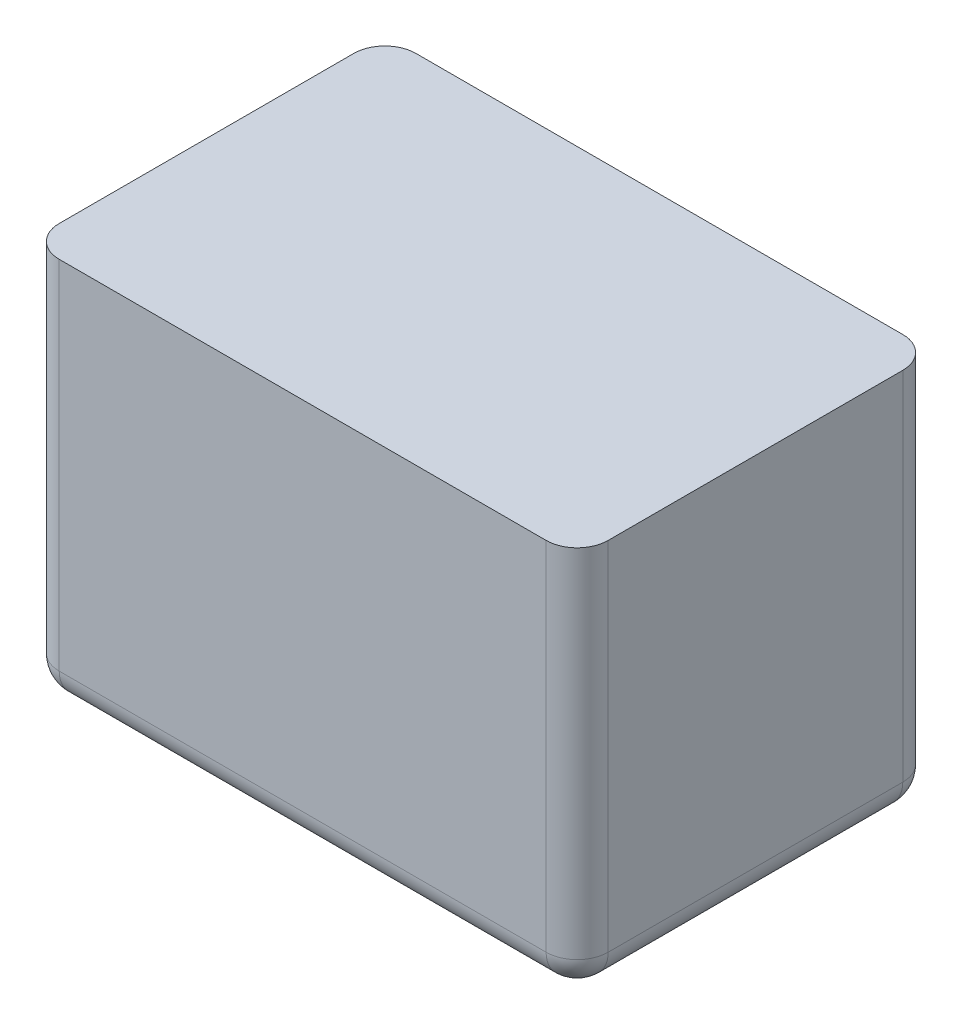
ISO-10303-21;
HEADER;
FILE_DESCRIPTION(('STEP AP214'),'2;1');
FILE_NAME('part.step','',(''),(''),'','','');
FILE_SCHEMA(('AUTOMOTIVE_DESIGN { 1 0 10303 214 1 1 1 1 }'));
ENDSEC;
DATA;
#1=APPLICATION_CONTEXT('core data for automotive mechanical design processes');
#2=APPLICATION_PROTOCOL_DEFINITION('international standard','automotive_design',2000,#1);
#3=PRODUCT_CONTEXT('',#1,'mechanical');
#4=PRODUCT('Part','Part','',(#3));
#5=PRODUCT_RELATED_PRODUCT_CATEGORY('part','',(#4));
#6=PRODUCT_DEFINITION_FORMATION('','',#4);
#7=PRODUCT_DEFINITION_CONTEXT('part definition',#1,'design');
#8=PRODUCT_DEFINITION('design','',#6,#7);
#9=PRODUCT_DEFINITION_SHAPE('','',#8);
#10=(LENGTH_UNIT() NAMED_UNIT(*) SI_UNIT(.MILLI.,.METRE.));
#11=(NAMED_UNIT(*) PLANE_ANGLE_UNIT() SI_UNIT($,.RADIAN.));
#12=(NAMED_UNIT(*) SI_UNIT($,.STERADIAN.) SOLID_ANGLE_UNIT());
#13=UNCERTAINTY_MEASURE_WITH_UNIT(LENGTH_MEASURE(1.E-05),#10,'distance_accuracy_value','');
#14=(GEOMETRIC_REPRESENTATION_CONTEXT(3) GLOBAL_UNCERTAINTY_ASSIGNED_CONTEXT((#13)) GLOBAL_UNIT_ASSIGNED_CONTEXT((#10,
#11,#12)) REPRESENTATION_CONTEXT('',''));
#15=CARTESIAN_POINT('',(0.,0.,0.));
#16=DIRECTION('',(0.,0.,1.));
#17=DIRECTION('',(1.,0.,0.));
#18=AXIS2_PLACEMENT_3D('',#15,#16,#17);
#19=CARTESIAN_POINT('',(8.85,0.,5.75));
#20=DIRECTION('',(1.,0.,0.));
#21=DIRECTION('',(0.,1.,0.));
#22=AXIS2_PLACEMENT_3D('',#19,#20,#21);
#23=PLANE('',#22);
#24=DIRECTION('',(0.,-1.,0.));
#25=VECTOR('',#24,1.);
#26=CARTESIAN_POINT('',(8.85,0.,-4.75));
#27=LINE('',#26,#25);
#28=CARTESIAN_POINT('',(8.85,12.5,-4.75));
#29=VERTEX_POINT('',#28);
#30=CARTESIAN_POINT('',(8.85,1.,-4.75));
#31=VERTEX_POINT('',#30);
#32=EDGE_CURVE('E247',#29,#31,#27,.T.);
#33=ORIENTED_EDGE('',*,*,#32,.F.);
#34=DIRECTION('',(0.,0.,-1.));
#35=VECTOR('',#34,1.);
#36=CARTESIAN_POINT('',(8.85,12.5,5.75));
#37=LINE('',#36,#35);
#38=CARTESIAN_POINT('',(8.85,12.5,4.75));
#39=VERTEX_POINT('',#38);
#40=EDGE_CURVE('E176',#39,#29,#37,.T.);
#41=ORIENTED_EDGE('',*,*,#40,.F.);
#42=DIRECTION('',(0.,1.,0.));
#43=VECTOR('',#42,1.);
#44=CARTESIAN_POINT('',(8.85,0.,4.75));
#45=LINE('',#44,#43);
#46=CARTESIAN_POINT('',(8.85,1.,4.75));
#47=VERTEX_POINT('',#46);
#48=EDGE_CURVE('E10',#47,#39,#45,.T.);
#49=ORIENTED_EDGE('',*,*,#48,.F.);
#50=DIRECTION('',(0.,0.,1.));
#51=VECTOR('',#50,1.);
#52=CARTESIAN_POINT('',(8.85,1.,2.875));
#53=LINE('',#52,#51);
#54=EDGE_CURVE('E19',#31,#47,#53,.T.);
#55=ORIENTED_EDGE('',*,*,#54,.F.);
#56=EDGE_LOOP('',(#33,#41,#49,#55));
#57=FACE_BOUND('',#56,.T.);
#58=ADVANCED_FACE('F16',(#57),#23,.T.);
#59=CARTESIAN_POINT('',(7.85,0.,4.75));
#60=DIRECTION('',(0.,1.,0.));
#61=DIRECTION('',(0.707106781186547,0.,0.707106781186548));
#62=AXIS2_PLACEMENT_3D('',#59,#60,#61);
#63=CYLINDRICAL_SURFACE('',#62,1.);
#64=CARTESIAN_POINT('',(7.85,12.5,4.75));
#65=DIRECTION('',(0.,-1.,0.));
#66=DIRECTION('',(0.707106781186547,0.,0.707106781186548));
#67=AXIS2_PLACEMENT_3D('',#64,#65,#66);
#68=CIRCLE('',#67,1.);
#69=CARTESIAN_POINT('',(7.85,12.5,5.75));
#70=VERTEX_POINT('',#69);
#71=EDGE_CURVE('E180',#39,#70,#68,.T.);
#72=ORIENTED_EDGE('',*,*,#71,.T.);
#73=DIRECTION('',(0.,-1.,0.));
#74=VECTOR('',#73,1.);
#75=CARTESIAN_POINT('',(7.85,0.,5.75));
#76=LINE('',#75,#74);
#77=CARTESIAN_POINT('',(7.85,1.,5.75));
#78=VERTEX_POINT('',#77);
#79=EDGE_CURVE('E312',#70,#78,#76,.T.);
#80=ORIENTED_EDGE('',*,*,#79,.T.);
#81=CARTESIAN_POINT('',(7.85,1.,4.75));
#82=DIRECTION('',(0.,1.,0.));
#83=DIRECTION('',(0.,0.,1.));
#84=AXIS2_PLACEMENT_3D('',#81,#82,#83);
#85=CIRCLE('',#84,1.);
#86=EDGE_CURVE('E45',#78,#47,#85,.T.);
#87=ORIENTED_EDGE('',*,*,#86,.T.);
#88=ORIENTED_EDGE('',*,*,#48,.T.);
#89=EDGE_LOOP('',(#72,#80,#87,#88));
#90=FACE_BOUND('',#89,.T.);
#91=ADVANCED_FACE('F334',(#90),#63,.T.);
#92=CARTESIAN_POINT('',(7.85,1.,2.875));
#93=DIRECTION('',(0.,0.,-1.));
#94=DIRECTION('',(0.707106781186547,-0.707106781186548,0.));
#95=AXIS2_PLACEMENT_3D('',#92,#93,#94);
#96=CYLINDRICAL_SURFACE('',#95,1.);
#97=CARTESIAN_POINT('',(7.85,1.,-4.75));
#98=DIRECTION('',(0.,0.,-1.));
#99=DIRECTION('',(0.707106781186547,-0.707106781186548,0.));
#100=AXIS2_PLACEMENT_3D('',#97,#98,#99);
#101=CIRCLE('',#100,1.);
#102=CARTESIAN_POINT('',(7.85,0.,-4.75));
#103=VERTEX_POINT('',#102);
#104=EDGE_CURVE('E271',#31,#103,#101,.T.);
#105=ORIENTED_EDGE('',*,*,#104,.F.);
#106=ORIENTED_EDGE('',*,*,#54,.T.);
#107=CARTESIAN_POINT('',(7.85,1.,4.75));
#108=DIRECTION('',(0.,0.,-1.));
#109=DIRECTION('',(1.,0.,0.));
#110=AXIS2_PLACEMENT_3D('',#107,#108,#109);
#111=CIRCLE('',#110,1.);
#112=CARTESIAN_POINT('',(7.85,0.,4.75));
#113=VERTEX_POINT('',#112);
#114=EDGE_CURVE('E320',#47,#113,#111,.T.);
#115=ORIENTED_EDGE('',*,*,#114,.T.);
#116=DIRECTION('',(0.,0.,-1.));
#117=VECTOR('',#116,1.);
#118=CARTESIAN_POINT('',(7.85,0.,2.875));
#119=LINE('',#118,#117);
#120=EDGE_CURVE('E190',#113,#103,#119,.T.);
#121=ORIENTED_EDGE('',*,*,#120,.T.);
#122=EDGE_LOOP('',(#105,#106,#115,#121));
#123=FACE_BOUND('',#122,.T.);
#124=ADVANCED_FACE('F329',(#123),#96,.T.);
#125=CARTESIAN_POINT('',(7.85,1.,4.75));
#126=DIRECTION('',(-0.816496580927726,-0.408248290463863,0.408248290463862));
#127=DIRECTION('',(0.577350269189625,-0.577350269189627,0.577350269189626));
#128=AXIS2_PLACEMENT_3D('',#125,#126,#127);
#129=SPHERICAL_SURFACE('',#128,1.);
#130=ORIENTED_EDGE('',*,*,#86,.F.);
#131=CARTESIAN_POINT('',(7.85,1.,4.75));
#132=DIRECTION('',(-1.,0.,0.));
#133=DIRECTION('',(0.,-1.,0.));
#134=AXIS2_PLACEMENT_3D('',#131,#132,#133);
#135=CIRCLE('',#134,1.);
#136=EDGE_CURVE('E316',#113,#78,#135,.T.);
#137=ORIENTED_EDGE('',*,*,#136,.F.);
#138=ORIENTED_EDGE('',*,*,#114,.F.);
#139=EDGE_LOOP('',(#130,#137,#138));
#140=FACE_BOUND('',#139,.T.);
#141=ADVANCED_FACE('F332',(#140),#129,.T.);
#142=CARTESIAN_POINT('',(8.85,0.,-5.75));
#143=DIRECTION('',(0.,0.,-1.));
#144=DIRECTION('',(0.,-1.,0.));
#145=AXIS2_PLACEMENT_3D('',#142,#143,#144);
#146=PLANE('',#145);
#147=DIRECTION('',(0.,-1.,0.));
#148=VECTOR('',#147,1.);
#149=CARTESIAN_POINT('',(-7.85,0.,-5.75));
#150=LINE('',#149,#148);
#151=CARTESIAN_POINT('',(-7.85,12.5,-5.75));
#152=VERTEX_POINT('',#151);
#153=CARTESIAN_POINT('',(-7.85,1.,-5.75));
#154=VERTEX_POINT('',#153);
#155=EDGE_CURVE('E199',#152,#154,#150,.T.);
#156=ORIENTED_EDGE('',*,*,#155,.F.);
#157=DIRECTION('',(-1.,0.,0.));
#158=VECTOR('',#157,1.);
#159=CARTESIAN_POINT('',(8.85,12.5,-5.75));
#160=LINE('',#159,#158);
#161=CARTESIAN_POINT('',(7.85,12.5,-5.75));
#162=VERTEX_POINT('',#161);
#163=EDGE_CURVE('E179',#162,#152,#160,.T.);
#164=ORIENTED_EDGE('',*,*,#163,.F.);
#165=DIRECTION('',(0.,1.,0.));
#166=VECTOR('',#165,1.);
#167=CARTESIAN_POINT('',(7.85,0.,-5.75));
#168=LINE('',#167,#166);
#169=CARTESIAN_POINT('',(7.85,1.,-5.75));
#170=VERTEX_POINT('',#169);
#171=EDGE_CURVE('E267',#170,#162,#168,.T.);
#172=ORIENTED_EDGE('',*,*,#171,.F.);
#173=DIRECTION('',(1.,0.,0.));
#174=VECTOR('',#173,1.);
#175=CARTESIAN_POINT('',(4.425,1.,-5.75));
#176=LINE('',#175,#174);
#177=EDGE_CURVE('E253',#154,#170,#176,.T.);
#178=ORIENTED_EDGE('',*,*,#177,.F.);
#179=EDGE_LOOP('',(#156,#164,#172,#178));
#180=FACE_BOUND('',#179,.T.);
#181=ADVANCED_FACE('F516',(#180),#146,.T.);
#182=CARTESIAN_POINT('',(-4.425,1.,4.75));
#183=DIRECTION('',(1.,0.,0.));
#184=DIRECTION('',(0.,-0.707106781186548,0.707106781186547));
#185=AXIS2_PLACEMENT_3D('',#182,#183,#184);
#186=CYLINDRICAL_SURFACE('',#185,1.);
#187=CARTESIAN_POINT('',(-7.85,1.,4.75));
#188=DIRECTION('',(-1.,0.,0.));
#189=DIRECTION('',(0.,-0.707106781186548,0.707106781186547));
#190=AXIS2_PLACEMENT_3D('',#187,#188,#189);
#191=CIRCLE('',#190,1.);
#192=CARTESIAN_POINT('',(-7.85,0.,4.75));
#193=VERTEX_POINT('',#192);
#194=CARTESIAN_POINT('',(-7.85,1.,5.75));
#195=VERTEX_POINT('',#194);
#196=EDGE_CURVE('E305',#193,#195,#191,.T.);
#197=ORIENTED_EDGE('',*,*,#196,.F.);
#198=DIRECTION('',(1.,0.,0.));
#199=VECTOR('',#198,1.);
#200=CARTESIAN_POINT('',(-4.425,0.,4.75));
#201=LINE('',#200,#199);
#202=EDGE_CURVE('E185',#193,#113,#201,.T.);
#203=ORIENTED_EDGE('',*,*,#202,.T.);
#204=ORIENTED_EDGE('',*,*,#136,.T.);
#205=DIRECTION('',(-1.,0.,0.));
#206=VECTOR('',#205,1.);
#207=CARTESIAN_POINT('',(-4.425,1.,5.75));
#208=LINE('',#207,#206);
#209=EDGE_CURVE('E309',#78,#195,#208,.T.);
#210=ORIENTED_EDGE('',*,*,#209,.T.);
#211=EDGE_LOOP('',(#197,#203,#204,#210));
#212=FACE_BOUND('',#211,.T.);
#213=ADVANCED_FACE('F342',(#212),#186,.T.);
#214=CARTESIAN_POINT('',(-8.85,0.,5.75));
#215=DIRECTION('',(0.,0.,1.));
#216=DIRECTION('',(1.,0.,0.));
#217=AXIS2_PLACEMENT_3D('',#214,#215,#216);
#218=PLANE('',#217);
#219=DIRECTION('',(0.,1.,0.));
#220=VECTOR('',#219,1.);
#221=CARTESIAN_POINT('',(-7.85,0.,5.75));
#222=LINE('',#221,#220);
#223=CARTESIAN_POINT('',(-7.85,12.5,5.75));
#224=VERTEX_POINT('',#223);
#225=EDGE_CURVE('E172',#195,#224,#222,.T.);
#226=ORIENTED_EDGE('',*,*,#225,.F.);
#227=ORIENTED_EDGE('',*,*,#209,.F.);
#228=ORIENTED_EDGE('',*,*,#79,.F.);
#229=DIRECTION('',(1.,0.,0.));
#230=VECTOR('',#229,1.);
#231=CARTESIAN_POINT('',(-8.85,12.5,5.75));
#232=LINE('',#231,#230);
#233=EDGE_CURVE('E283',#224,#70,#232,.T.);
#234=ORIENTED_EDGE('',*,*,#233,.F.);
#235=EDGE_LOOP('',(#226,#227,#228,#234));
#236=FACE_BOUND('',#235,.T.);
#237=ADVANCED_FACE('F340',(#236),#218,.T.);
#238=CARTESIAN_POINT('',(-7.85,1.,4.75));
#239=DIRECTION('',(-0.408248290463863,-0.408248290463863,-0.816496580927726));
#240=DIRECTION('',(-0.577350269189626,-0.577350269189625,0.577350269189626));
#241=AXIS2_PLACEMENT_3D('',#238,#239,#240);
#242=SPHERICAL_SURFACE('',#241,1.);
#243=CARTESIAN_POINT('',(-7.85,1.,4.75));
#244=DIRECTION('',(0.,0.,-1.));
#245=DIRECTION('',(0.,-1.,0.));
#246=AXIS2_PLACEMENT_3D('',#243,#244,#245);
#247=CIRCLE('',#246,1.);
#248=CARTESIAN_POINT('',(-8.85,1.,4.75));
#249=VERTEX_POINT('',#248);
#250=EDGE_CURVE('E217',#193,#249,#247,.T.);
#251=ORIENTED_EDGE('',*,*,#250,.F.);
#252=ORIENTED_EDGE('',*,*,#196,.T.);
#253=CARTESIAN_POINT('',(-7.85,1.,4.75));
#254=DIRECTION('',(0.,1.,0.));
#255=DIRECTION('',(-1.,0.,0.));
#256=AXIS2_PLACEMENT_3D('',#253,#254,#255);
#257=CIRCLE('',#256,1.);
#258=EDGE_CURVE('E189',#249,#195,#257,.T.);
#259=ORIENTED_EDGE('',*,*,#258,.F.);
#260=EDGE_LOOP('',(#251,#252,#259));
#261=FACE_BOUND('',#260,.T.);
#262=ADVANCED_FACE('F346',(#261),#242,.T.);
#263=CARTESIAN_POINT('',(-7.85,0.,4.75));
#264=DIRECTION('',(0.,1.,0.));
#265=DIRECTION('',(-0.707106781186547,0.,0.707106781186548));
#266=AXIS2_PLACEMENT_3D('',#263,#264,#265);
#267=CYLINDRICAL_SURFACE('',#266,1.);
#268=CARTESIAN_POINT('',(-7.85,12.5,4.75));
#269=DIRECTION('',(0.,-1.,0.));
#270=DIRECTION('',(-0.707106781186547,0.,0.707106781186548));
#271=AXIS2_PLACEMENT_3D('',#268,#269,#270);
#272=CIRCLE('',#271,1.);
#273=CARTESIAN_POINT('',(-8.85,12.5,4.75));
#274=VERTEX_POINT('',#273);
#275=EDGE_CURVE('E279',#224,#274,#272,.T.);
#276=ORIENTED_EDGE('',*,*,#275,.T.);
#277=DIRECTION('',(0.,-1.,0.));
#278=VECTOR('',#277,1.);
#279=CARTESIAN_POINT('',(-8.85,0.,4.75));
#280=LINE('',#279,#278);
#281=EDGE_CURVE('E295',#274,#249,#280,.T.);
#282=ORIENTED_EDGE('',*,*,#281,.T.);
#283=ORIENTED_EDGE('',*,*,#258,.T.);
#284=ORIENTED_EDGE('',*,*,#225,.T.);
#285=EDGE_LOOP('',(#276,#282,#283,#284));
#286=FACE_BOUND('',#285,.T.);
#287=ADVANCED_FACE('F366',(#286),#267,.T.);
#288=CARTESIAN_POINT('',(0.,0.,0.));
#289=DIRECTION('',(0.,1.,0.));
#290=DIRECTION('',(1.,0.,0.));
#291=AXIS2_PLACEMENT_3D('',#288,#289,#290);
#292=PLANE('',#291);
#293=CARTESIAN_POINT('',(4.195,0.,1.04));
#294=DIRECTION('',(0.,1.,0.));
#295=DIRECTION('',(1.,0.,0.));
#296=AXIS2_PLACEMENT_3D('',#293,#294,#295);
#297=CIRCLE('',#296,2.5);
#298=CARTESIAN_POINT('',(1.695,0.,1.04));
#299=VERTEX_POINT('',#298);
#300=EDGE_CURVE('E200',#299,#299,#297,.T.);
#301=ORIENTED_EDGE('',*,*,#300,.T.);
#302=EDGE_LOOP('',(#301));
#303=FACE_BOUND('',#302,.T.);
#304=CARTESIAN_POINT('',(-4.195,0.,1.04));
#305=DIRECTION('',(0.,1.,0.));
#306=DIRECTION('',(1.,0.,0.));
#307=AXIS2_PLACEMENT_3D('',#304,#305,#306);
#308=CIRCLE('',#307,2.5);
#309=CARTESIAN_POINT('',(-6.695,0.,1.04));
#310=VERTEX_POINT('',#309);
#311=EDGE_CURVE('E175',#310,#310,#308,.T.);
#312=ORIENTED_EDGE('',*,*,#311,.T.);
#313=EDGE_LOOP('',(#312));
#314=FACE_BOUND('',#313,.T.);
#315=DIRECTION('',(-1.,0.,0.));
#316=VECTOR('',#315,1.);
#317=CARTESIAN_POINT('',(4.425,0.,-4.75));
#318=LINE('',#317,#316);
#319=CARTESIAN_POINT('',(-7.85,0.,-4.75));
#320=VERTEX_POINT('',#319);
#321=EDGE_CURVE('E242',#103,#320,#318,.T.);
#322=ORIENTED_EDGE('',*,*,#321,.F.);
#323=ORIENTED_EDGE('',*,*,#120,.F.);
#324=ORIENTED_EDGE('',*,*,#202,.F.);
#325=DIRECTION('',(0.,0.,1.));
#326=VECTOR('',#325,1.);
#327=CARTESIAN_POINT('',(-7.85,0.,-2.875));
#328=LINE('',#327,#326);
#329=EDGE_CURVE('E221',#320,#193,#328,.T.);
#330=ORIENTED_EDGE('',*,*,#329,.F.);
#331=EDGE_LOOP('',(#322,#323,#324,#330));
#332=FACE_BOUND('',#331,.T.);
#333=ADVANCED_FACE('F353',(#303,#314,#332),#292,.F.);
#334=CARTESIAN_POINT('',(-7.85,1.,-2.875));
#335=DIRECTION('',(0.,0.,1.));
#336=DIRECTION('',(-0.707106781186548,-0.707106781186547,0.));
#337=AXIS2_PLACEMENT_3D('',#334,#335,#336);
#338=CYLINDRICAL_SURFACE('',#337,1.);
#339=CARTESIAN_POINT('',(-7.85,1.,-4.75));
#340=DIRECTION('',(0.,0.,-1.));
#341=DIRECTION('',(-0.707106781186548,-0.707106781186547,0.));
#342=AXIS2_PLACEMENT_3D('',#339,#340,#341);
#343=CIRCLE('',#342,1.);
#344=CARTESIAN_POINT('',(-8.85,1.,-4.75));
#345=VERTEX_POINT('',#344);
#346=EDGE_CURVE('E257',#320,#345,#343,.T.);
#347=ORIENTED_EDGE('',*,*,#346,.F.);
#348=ORIENTED_EDGE('',*,*,#329,.T.);
#349=ORIENTED_EDGE('',*,*,#250,.T.);
#350=DIRECTION('',(0.,0.,-1.));
#351=VECTOR('',#350,1.);
#352=CARTESIAN_POINT('',(-8.85,1.,-2.875));
#353=LINE('',#352,#351);
#354=EDGE_CURVE('E292',#249,#345,#353,.T.);
#355=ORIENTED_EDGE('',*,*,#354,.T.);
#356=EDGE_LOOP('',(#347,#348,#349,#355));
#357=FACE_BOUND('',#356,.T.);
#358=ADVANCED_FACE('F349',(#357),#338,.T.);
#359=CARTESIAN_POINT('',(-8.85,0.,-5.75));
#360=DIRECTION('',(-1.,0.,0.));
#361=DIRECTION('',(0.,1.,0.));
#362=AXIS2_PLACEMENT_3D('',#359,#360,#361);
#363=PLANE('',#362);
#364=DIRECTION('',(0.,1.,0.));
#365=VECTOR('',#364,1.);
#366=CARTESIAN_POINT('',(-8.85,0.,-4.75));
#367=LINE('',#366,#365);
#368=CARTESIAN_POINT('',(-8.85,12.5,-4.75));
#369=VERTEX_POINT('',#368);
#370=EDGE_CURVE('E198',#345,#369,#367,.T.);
#371=ORIENTED_EDGE('',*,*,#370,.F.);
#372=ORIENTED_EDGE('',*,*,#354,.F.);
#373=ORIENTED_EDGE('',*,*,#281,.F.);
#374=DIRECTION('',(0.,0.,1.));
#375=VECTOR('',#374,1.);
#376=CARTESIAN_POINT('',(-8.85,12.5,-5.75));
#377=LINE('',#376,#375);
#378=EDGE_CURVE('E275',#369,#274,#377,.T.);
#379=ORIENTED_EDGE('',*,*,#378,.F.);
#380=EDGE_LOOP('',(#371,#372,#373,#379));
#381=FACE_BOUND('',#380,.T.);
#382=ADVANCED_FACE('F549',(#381),#363,.T.);
#383=CARTESIAN_POINT('',(0.,12.5,0.));
#384=DIRECTION('',(0.,1.,0.));
#385=DIRECTION('',(1.,0.,0.));
#386=AXIS2_PLACEMENT_3D('',#383,#384,#385);
#387=PLANE('',#386);
#388=CARTESIAN_POINT('',(-7.85,12.5,-4.75));
#389=DIRECTION('',(0.,-1.,0.));
#390=DIRECTION('',(-0.707106781186548,0.,-0.707106781186547));
#391=AXIS2_PLACEMENT_3D('',#388,#389,#390);
#392=CIRCLE('',#391,1.);
#393=EDGE_CURVE('E212',#369,#152,#392,.T.);
#394=ORIENTED_EDGE('',*,*,#393,.F.);
#395=ORIENTED_EDGE('',*,*,#378,.T.);
#396=ORIENTED_EDGE('',*,*,#275,.F.);
#397=ORIENTED_EDGE('',*,*,#233,.T.);
#398=ORIENTED_EDGE('',*,*,#71,.F.);
#399=ORIENTED_EDGE('',*,*,#40,.T.);
#400=CARTESIAN_POINT('',(7.85,12.5,-4.75));
#401=DIRECTION('',(0.,-1.,0.));
#402=DIRECTION('',(0.707106781186548,0.,-0.707106781186547));
#403=AXIS2_PLACEMENT_3D('',#400,#401,#402);
#404=CIRCLE('',#403,1.);
#405=EDGE_CURVE('E252',#162,#29,#404,.T.);
#406=ORIENTED_EDGE('',*,*,#405,.F.);
#407=ORIENTED_EDGE('',*,*,#163,.T.);
#408=EDGE_LOOP('',(#394,#395,#396,#397,#398,#399,#406,#407));
#409=FACE_BOUND('',#408,.T.);
#410=ADVANCED_FACE('F363',(#409),#387,.T.);
#411=CARTESIAN_POINT('',(7.85,1.,-4.75));
#412=DIRECTION('',(-0.816496580927726,-0.408248290463863,-0.408248290463863));
#413=DIRECTION('',(0.577350269189626,-0.577350269189626,-0.577350269189625));
#414=AXIS2_PLACEMENT_3D('',#411,#412,#413);
#415=SPHERICAL_SURFACE('',#414,1.);
#416=CARTESIAN_POINT('',(7.85,1.,-4.75));
#417=DIRECTION('',(0.,1.,0.));
#418=DIRECTION('',(1.,0.,0.));
#419=AXIS2_PLACEMENT_3D('',#416,#417,#418);
#420=CIRCLE('',#419,1.);
#421=EDGE_CURVE('E251',#31,#170,#420,.T.);
#422=ORIENTED_EDGE('',*,*,#421,.F.);
#423=ORIENTED_EDGE('',*,*,#104,.T.);
#424=CARTESIAN_POINT('',(7.85,1.,-4.75));
#425=DIRECTION('',(-1.,0.,0.));
#426=DIRECTION('',(0.,0.,-1.));
#427=AXIS2_PLACEMENT_3D('',#424,#425,#426);
#428=CIRCLE('',#427,1.);
#429=EDGE_CURVE('E225',#170,#103,#428,.T.);
#430=ORIENTED_EDGE('',*,*,#429,.F.);
#431=EDGE_LOOP('',(#422,#423,#430));
#432=FACE_BOUND('',#431,.T.);
#433=ADVANCED_FACE('F357',(#432),#415,.T.);
#434=CARTESIAN_POINT('',(7.85,0.,-4.75));
#435=DIRECTION('',(0.,1.,0.));
#436=DIRECTION('',(0.707106781186548,0.,-0.707106781186547));
#437=AXIS2_PLACEMENT_3D('',#434,#435,#436);
#438=CYLINDRICAL_SURFACE('',#437,1.);
#439=ORIENTED_EDGE('',*,*,#405,.T.);
#440=ORIENTED_EDGE('',*,*,#32,.T.);
#441=ORIENTED_EDGE('',*,*,#421,.T.);
#442=ORIENTED_EDGE('',*,*,#171,.T.);
#443=EDGE_LOOP('',(#439,#440,#441,#442));
#444=FACE_BOUND('',#443,.T.);
#445=ADVANCED_FACE('F359',(#444),#438,.T.);
#446=CARTESIAN_POINT('',(-7.85,1.,-4.75));
#447=DIRECTION('',(0.408248290463863,-0.816496580927726,0.408248290463863));
#448=DIRECTION('',(-0.577350269189625,-0.577350269189626,-0.577350269189626));
#449=AXIS2_PLACEMENT_3D('',#446,#447,#448);
#450=SPHERICAL_SURFACE('',#449,1.);
#451=CARTESIAN_POINT('',(-7.85,1.,-4.75));
#452=DIRECTION('',(1.,0.,0.));
#453=DIRECTION('',(0.,-1.,0.));
#454=AXIS2_PLACEMENT_3D('',#451,#452,#453);
#455=CIRCLE('',#454,1.);
#456=EDGE_CURVE('E245',#320,#154,#455,.T.);
#457=ORIENTED_EDGE('',*,*,#456,.F.);
#458=ORIENTED_EDGE('',*,*,#346,.T.);
#459=CARTESIAN_POINT('',(-7.85,1.,-4.75));
#460=DIRECTION('',(0.,1.,0.));
#461=DIRECTION('',(0.,0.,-1.));
#462=AXIS2_PLACEMENT_3D('',#459,#460,#461);
#463=CIRCLE('',#462,1.);
#464=EDGE_CURVE('E194',#154,#345,#463,.T.);
#465=ORIENTED_EDGE('',*,*,#464,.F.);
#466=EDGE_LOOP('',(#457,#458,#465));
#467=FACE_BOUND('',#466,.T.);
#468=ADVANCED_FACE('F578',(#467),#450,.T.);
#469=CARTESIAN_POINT('',(4.425,1.,-4.75));
#470=DIRECTION('',(-1.,0.,0.));
#471=DIRECTION('',(0.,-0.707106781186548,-0.707106781186547));
#472=AXIS2_PLACEMENT_3D('',#469,#470,#471);
#473=CYLINDRICAL_SURFACE('',#472,1.);
#474=ORIENTED_EDGE('',*,*,#429,.T.);
#475=ORIENTED_EDGE('',*,*,#321,.T.);
#476=ORIENTED_EDGE('',*,*,#456,.T.);
#477=ORIENTED_EDGE('',*,*,#177,.T.);
#478=EDGE_LOOP('',(#474,#475,#476,#477));
#479=FACE_BOUND('',#478,.T.);
#480=ADVANCED_FACE('F606',(#479),#473,.T.);
#481=CARTESIAN_POINT('',(-7.85,0.,-4.75));
#482=DIRECTION('',(0.,1.,0.));
#483=DIRECTION('',(-0.707106781186548,0.,-0.707106781186547));
#484=AXIS2_PLACEMENT_3D('',#481,#482,#483);
#485=CYLINDRICAL_SURFACE('',#484,1.);
#486=ORIENTED_EDGE('',*,*,#393,.T.);
#487=ORIENTED_EDGE('',*,*,#155,.T.);
#488=ORIENTED_EDGE('',*,*,#464,.T.);
#489=ORIENTED_EDGE('',*,*,#370,.T.);
#490=EDGE_LOOP('',(#486,#487,#488,#489));
#491=FACE_BOUND('',#490,.T.);
#492=ADVANCED_FACE('F610',(#491),#485,.T.);
#493=CARTESIAN_POINT('',(4.195,0.,1.04));
#494=DIRECTION('',(0.,1.,0.));
#495=DIRECTION('',(1.,0.,0.));
#496=AXIS2_PLACEMENT_3D('',#493,#494,#495);
#497=CYLINDRICAL_SURFACE('',#496,2.5);
#498=ORIENTED_EDGE('',*,*,#300,.F.);
#499=DIRECTION('',(0.,1.,0.));
#500=VECTOR('',#499,1.);
#501=CARTESIAN_POINT('',(1.695,0.,1.04));
#502=LINE('',#501,#500);
#503=CARTESIAN_POINT('',(1.695,2.,1.04));
#504=VERTEX_POINT('',#503);
#505=EDGE_CURVE('E204',#299,#504,#502,.T.);
#506=ORIENTED_EDGE('',*,*,#505,.T.);
#507=CARTESIAN_POINT('',(4.195,2.,1.04));
#508=DIRECTION('',(0.,-1.,0.));
#509=DIRECTION('',(1.,0.,0.));
#510=AXIS2_PLACEMENT_3D('',#507,#508,#509);
#511=CIRCLE('',#510,2.5);
#512=CARTESIAN_POINT('',(4.195,2.,-1.46));
#513=VERTEX_POINT('',#512);
#514=EDGE_CURVE('E216',#513,#504,#511,.T.);
#515=ORIENTED_EDGE('',*,*,#514,.F.);
#516=CARTESIAN_POINT('',(4.195,2.,1.04));
#517=DIRECTION('',(0.,-1.,0.));
#518=DIRECTION('',(1.,0.,0.));
#519=AXIS2_PLACEMENT_3D('',#516,#517,#518);
#520=CIRCLE('',#519,2.5);
#521=EDGE_CURVE('E205',#504,#513,#520,.T.);
#522=ORIENTED_EDGE('',*,*,#521,.F.);
#523=ORIENTED_EDGE('',*,*,#505,.F.);
#524=EDGE_LOOP('',(#498,#506,#515,#522,#523));
#525=FACE_BOUND('',#524,.T.);
#526=ADVANCED_FACE('F619',(#525),#497,.F.);
#527=CARTESIAN_POINT('',(4.195,4.,1.04));
#528=DIRECTION('',(0.,-1.,0.));
#529=DIRECTION('',(0.,0.,-1.));
#530=AXIS2_PLACEMENT_3D('',#527,#528,#529);
#531=PLANE('',#530);
#532=CARTESIAN_POINT('',(4.195,4.,1.04));
#533=DIRECTION('',(0.,1.,0.));
#534=DIRECTION('',(1.,0.,0.));
#535=AXIS2_PLACEMENT_3D('',#532,#533,#534);
#536=CIRCLE('',#535,0.5);
#537=CARTESIAN_POINT('',(4.195,4.,0.54));
#538=VERTEX_POINT('',#537);
#539=EDGE_CURVE('E193',#538,#538,#536,.T.);
#540=ORIENTED_EDGE('',*,*,#539,.F.);
#541=EDGE_LOOP('',(#540));
#542=FACE_BOUND('',#541,.T.);
#543=ADVANCED_FACE('F625',(#542),#531,.T.);
#544=CARTESIAN_POINT('',(4.195,2.,-1.46));
#545=CARTESIAN_POINT('',(1.695,2.,-1.46));
#546=CARTESIAN_POINT('',(1.695,2.,1.04));
#547=CARTESIAN_POINT('',(1.695,2.,3.54));
#548=CARTESIAN_POINT('',(4.195,2.,3.54));
#549=CARTESIAN_POINT('',(6.695,2.,3.54));
#550=CARTESIAN_POINT('',(6.695,2.,1.04));
#551=CARTESIAN_POINT('',(6.695,2.,-1.46));
#552=CARTESIAN_POINT('',(4.195,2.,-1.46));
#553=CARTESIAN_POINT('',(4.195,4.,-1.46));
#554=CARTESIAN_POINT('',(1.695,4.,-1.46));
#555=CARTESIAN_POINT('',(1.695,4.,1.04));
#556=CARTESIAN_POINT('',(1.695,4.,3.54));
#557=CARTESIAN_POINT('',(4.195,4.,3.54));
#558=CARTESIAN_POINT('',(6.695,4.,3.54));
#559=CARTESIAN_POINT('',(6.695,4.,1.04));
#560=CARTESIAN_POINT('',(6.695,4.,-1.46));
#561=CARTESIAN_POINT('',(4.195,4.,-1.46));
#562=CARTESIAN_POINT('',(4.195,4.,0.54));
#563=CARTESIAN_POINT('',(3.695,4.,0.539999999999999));
#564=CARTESIAN_POINT('',(3.695,4.,1.04));
#565=CARTESIAN_POINT('',(3.695,4.,1.54));
#566=CARTESIAN_POINT('',(4.195,4.,1.54));
#567=CARTESIAN_POINT('',(4.695,4.,1.54));
#568=CARTESIAN_POINT('',(4.695,4.,1.04));
#569=CARTESIAN_POINT('',(4.695,4.,0.539999999999999));
#570=CARTESIAN_POINT('',(4.195,4.,0.54));
#571=(BOUNDED_SURFACE() B_SPLINE_SURFACE(2,2,((#544,#545,#546,#547,#548,#549,#550,#551,#552),
(#553,#554,#555,#556,#557,#558,#559,#560,#561),(#562,#563,#564,#565,#566,#567,#568,#569,#570)),
.UNSPECIFIED.,.F.,.T.,.F.) B_SPLINE_SURFACE_WITH_KNOTS((3,3),(3,2,2,2,3),(0.,1.5707963267949),
(-3.14159265358979,-1.5707963267949,0.,1.5707963267949,3.14159265358979),
.UNSPECIFIED.) GEOMETRIC_REPRESENTATION_ITEM() RATIONAL_B_SPLINE_SURFACE(((1.,0.707106781186548,
1.,0.707106781186548,1.,0.707106781186548,1.,0.707106781186548,1.),(0.707106781186547,0.5,
0.707106781186547,0.5,0.707106781186547,0.5,0.707106781186547,0.5,0.707106781186547),(1.,
0.707106781186548,1.,0.707106781186548,1.,0.707106781186548,1.,0.707106781186548,1.))) REPRESENTATION_ITEM('') SURFACE());
#572=CARTESIAN_POINT('',(4.195,2.,0.54));
#573=DIRECTION('',(-1.,0.,0.));
#574=DIRECTION('',(0.,0.,-1.));
#575=AXIS2_PLACEMENT_3D('',#572,#573,#574);
#576=CIRCLE('',#575,2.);
#577=EDGE_CURVE('E209',#538,#513,#576,.T.);
#578=ORIENTED_EDGE('',*,*,#539,.T.);
#579=ORIENTED_EDGE('',*,*,#577,.T.);
#580=ORIENTED_EDGE('',*,*,#514,.T.);
#581=ORIENTED_EDGE('',*,*,#521,.T.);
#582=ORIENTED_EDGE('',*,*,#577,.F.);
#583=EDGE_LOOP('',(#578,#579,#580,#581,#582));
#584=FACE_BOUND('',#583,.T.);
#585=ADVANCED_FACE('F629',(#584),#571,.T.);
#586=CARTESIAN_POINT('',(-4.195,0.,1.04));
#587=DIRECTION('',(0.,1.,0.));
#588=DIRECTION('',(1.,0.,0.));
#589=AXIS2_PLACEMENT_3D('',#586,#587,#588);
#590=CYLINDRICAL_SURFACE('',#589,2.5);
#591=ORIENTED_EDGE('',*,*,#311,.F.);
#592=DIRECTION('',(0.,1.,0.));
#593=VECTOR('',#592,1.);
#594=CARTESIAN_POINT('',(-6.695,0.,1.04));
#595=LINE('',#594,#593);
#596=CARTESIAN_POINT('',(-6.695,1.,1.04));
#597=VERTEX_POINT('',#596);
#598=EDGE_CURVE('E184',#310,#597,#595,.T.);
#599=ORIENTED_EDGE('',*,*,#598,.T.);
#600=CARTESIAN_POINT('',(-4.195,1.,1.04));
#601=DIRECTION('',(0.,-1.,0.));
#602=DIRECTION('',(1.,0.,0.));
#603=AXIS2_PLACEMENT_3D('',#600,#601,#602);
#604=CIRCLE('',#603,2.5);
#605=CARTESIAN_POINT('',(-4.195,1.,-1.46));
#606=VERTEX_POINT('',#605);
#607=EDGE_CURVE('E161',#606,#597,#604,.T.);
#608=ORIENTED_EDGE('',*,*,#607,.F.);
#609=CARTESIAN_POINT('',(-4.195,1.,1.04));
#610=DIRECTION('',(0.,-1.,0.));
#611=DIRECTION('',(1.,0.,0.));
#612=AXIS2_PLACEMENT_3D('',#609,#610,#611);
#613=CIRCLE('',#612,2.5);
#614=EDGE_CURVE('E158',#597,#606,#613,.T.);
#615=ORIENTED_EDGE('',*,*,#614,.F.);
#616=ORIENTED_EDGE('',*,*,#598,.F.);
#617=EDGE_LOOP('',(#591,#599,#608,#615,#616));
#618=FACE_BOUND('',#617,.T.);
#619=ADVANCED_FACE('F646',(#618),#590,.F.);
#620=CARTESIAN_POINT('',(-4.195,3.,1.04));
#621=DIRECTION('',(0.,-1.,0.));
#622=DIRECTION('',(0.,0.,-1.));
#623=AXIS2_PLACEMENT_3D('',#620,#621,#622);
#624=PLANE('',#623);
#625=CARTESIAN_POINT('',(-4.195,3.,1.04));
#626=DIRECTION('',(0.,1.,0.));
#627=DIRECTION('',(1.,0.,0.));
#628=AXIS2_PLACEMENT_3D('',#625,#626,#627);
#629=CIRCLE('',#628,0.5);
#630=CARTESIAN_POINT('',(-4.195,3.,0.54));
#631=VERTEX_POINT('',#630);
#632=EDGE_CURVE('E155',#631,#631,#629,.T.);
#633=ORIENTED_EDGE('',*,*,#632,.F.);
#634=EDGE_LOOP('',(#633));
#635=FACE_BOUND('',#634,.T.);
#636=ADVANCED_FACE('F655',(#635),#624,.T.);
#637=CARTESIAN_POINT('',(-4.195,1.,-1.46));
#638=CARTESIAN_POINT('',(-6.695,1.,-1.46));
#639=CARTESIAN_POINT('',(-6.695,1.,1.04));
#640=CARTESIAN_POINT('',(-6.695,1.,3.54));
#641=CARTESIAN_POINT('',(-4.195,1.,3.54));
#642=CARTESIAN_POINT('',(-1.695,1.,3.54));
#643=CARTESIAN_POINT('',(-1.695,1.,1.04));
#644=CARTESIAN_POINT('',(-1.695,1.,-1.46));
#645=CARTESIAN_POINT('',(-4.195,1.,-1.46));
#646=CARTESIAN_POINT('',(-4.195,3.,-1.46));
#647=CARTESIAN_POINT('',(-6.695,3.,-1.46));
#648=CARTESIAN_POINT('',(-6.695,3.,1.04));
#649=CARTESIAN_POINT('',(-6.695,3.,3.54));
#650=CARTESIAN_POINT('',(-4.195,3.,3.54));
#651=CARTESIAN_POINT('',(-1.695,3.,3.54));
#652=CARTESIAN_POINT('',(-1.695,3.,1.04));
#653=CARTESIAN_POINT('',(-1.695,3.,-1.46));
#654=CARTESIAN_POINT('',(-4.195,3.,-1.46));
#655=CARTESIAN_POINT('',(-4.195,3.,0.54));
#656=CARTESIAN_POINT('',(-4.695,3.,0.539999999999999));
#657=CARTESIAN_POINT('',(-4.695,3.,1.04));
#658=CARTESIAN_POINT('',(-4.695,3.,1.54));
#659=CARTESIAN_POINT('',(-4.195,3.,1.54));
#660=CARTESIAN_POINT('',(-3.695,3.,1.54));
#661=CARTESIAN_POINT('',(-3.695,3.,1.04));
#662=CARTESIAN_POINT('',(-3.695,3.,0.539999999999999));
#663=CARTESIAN_POINT('',(-4.195,3.,0.54));
#664=(BOUNDED_SURFACE() B_SPLINE_SURFACE(2,2,((#637,#638,#639,#640,#641,#642,#643,#644,#645),
(#646,#647,#648,#649,#650,#651,#652,#653,#654),(#655,#656,#657,#658,#659,#660,#661,#662,#663)),
.UNSPECIFIED.,.F.,.T.,.F.) B_SPLINE_SURFACE_WITH_KNOTS((3,3),(3,2,2,2,3),(0.,1.5707963267949),
(-3.14159265358979,-1.5707963267949,0.,1.5707963267949,3.14159265358979),
.UNSPECIFIED.) GEOMETRIC_REPRESENTATION_ITEM() RATIONAL_B_SPLINE_SURFACE(((1.,0.707106781186548,
1.,0.707106781186548,1.,0.707106781186548,1.,0.707106781186548,1.),(0.707106781186548,0.5,
0.707106781186548,0.5,0.707106781186548,0.5,0.707106781186548,0.5,0.707106781186548),(1.,
0.707106781186548,1.,0.707106781186548,1.,0.707106781186548,1.,0.707106781186548,1.))) REPRESENTATION_ITEM('') SURFACE());
#665=CARTESIAN_POINT('',(-4.195,1.,0.54));
#666=DIRECTION('',(-1.,0.,0.));
#667=DIRECTION('',(0.,0.,-1.));
#668=AXIS2_PLACEMENT_3D('',#665,#666,#667);
#669=CIRCLE('',#668,2.);
#670=EDGE_CURVE('E152',#631,#606,#669,.T.);
#671=ORIENTED_EDGE('',*,*,#632,.T.);
#672=ORIENTED_EDGE('',*,*,#670,.T.);
#673=ORIENTED_EDGE('',*,*,#607,.T.);
#674=ORIENTED_EDGE('',*,*,#614,.T.);
#675=ORIENTED_EDGE('',*,*,#670,.F.);
#676=EDGE_LOOP('',(#671,#672,#673,#674,#675));
#677=FACE_BOUND('',#676,.T.);
#678=ADVANCED_FACE('F153',(#677),#664,.T.);
#679=CLOSED_SHELL('',(#58,#91,#124,#141,#181,#213,#237,#262,#287,#333,#358,#382,#410,#433,#445,
#468,#480,#492,#526,#543,#585,#619,#636,#678));
#680=MANIFOLD_SOLID_BREP('B1',#679);
#681=ADVANCED_BREP_SHAPE_REPRESENTATION('',(#18,#680),#14);
#682=SHAPE_DEFINITION_REPRESENTATION(#9,#681);
ENDSEC;
END-ISO-10303-21;
